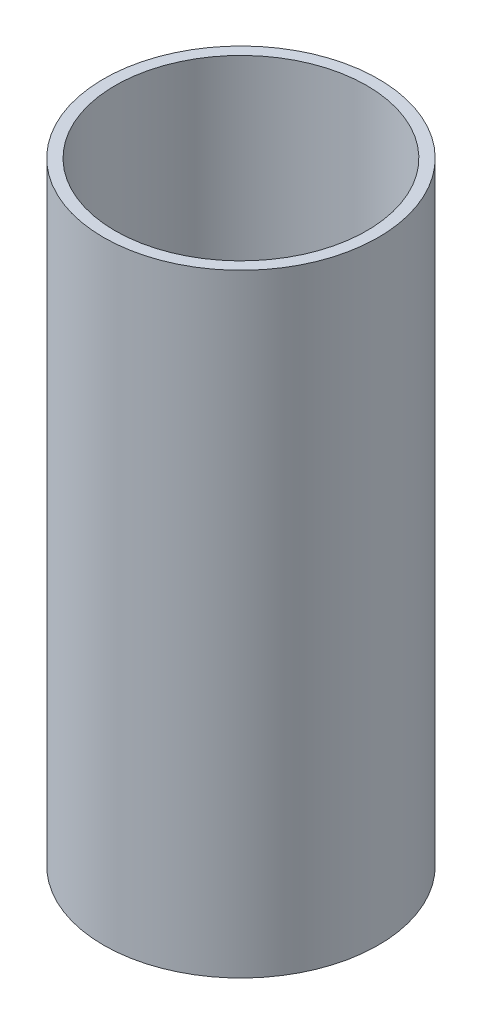
ISO-10303-21;
HEADER;
FILE_DESCRIPTION(('STEP AP214'),'2;1');
FILE_NAME('part.step','',(''),(''),'','','');
FILE_SCHEMA(('AUTOMOTIVE_DESIGN { 1 0 10303 214 1 1 1 1 }'));
ENDSEC;
DATA;
#1=APPLICATION_CONTEXT('core data for automotive mechanical design processes');
#2=APPLICATION_PROTOCOL_DEFINITION('international standard','automotive_design',2000,#1);
#3=PRODUCT_CONTEXT('',#1,'mechanical');
#4=PRODUCT('Part','Part','',(#3));
#5=PRODUCT_RELATED_PRODUCT_CATEGORY('part','',(#4));
#6=PRODUCT_DEFINITION_FORMATION('','',#4);
#7=PRODUCT_DEFINITION_CONTEXT('part definition',#1,'design');
#8=PRODUCT_DEFINITION('design','',#6,#7);
#9=PRODUCT_DEFINITION_SHAPE('','',#8);
#10=(LENGTH_UNIT() NAMED_UNIT(*) SI_UNIT(.MILLI.,.METRE.));
#11=(NAMED_UNIT(*) PLANE_ANGLE_UNIT() SI_UNIT($,.RADIAN.));
#12=(NAMED_UNIT(*) SI_UNIT($,.STERADIAN.) SOLID_ANGLE_UNIT());
#13=UNCERTAINTY_MEASURE_WITH_UNIT(LENGTH_MEASURE(1.E-05),#10,'distance_accuracy_value','');
#14=(GEOMETRIC_REPRESENTATION_CONTEXT(3) GLOBAL_UNCERTAINTY_ASSIGNED_CONTEXT((#13)) GLOBAL_UNIT_ASSIGNED_CONTEXT((#10,
#11,#12)) REPRESENTATION_CONTEXT('',''));
#15=CARTESIAN_POINT('',(0.,0.,0.));
#16=DIRECTION('',(0.,0.,1.));
#17=DIRECTION('',(1.,0.,0.));
#18=AXIS2_PLACEMENT_3D('',#15,#16,#17);
#19=CARTESIAN_POINT('',(0.,85.,0.));
#20=DIRECTION('',(0.,1.,0.));
#21=DIRECTION('',(0.,0.,1.));
#22=AXIS2_PLACEMENT_3D('',#19,#20,#21);
#23=PLANE('',#22);
#24=CARTESIAN_POINT('',(0.,85.,0.));
#25=DIRECTION('',(0.,1.,0.));
#26=DIRECTION('',(0.,0.,1.));
#27=AXIS2_PLACEMENT_3D('',#24,#25,#26);
#28=CIRCLE('',#27,19.05);
#29=CARTESIAN_POINT('',(0.,85.,19.05));
#30=VERTEX_POINT('',#29);
#31=EDGE_CURVE('E10',#30,#30,#28,.T.);
#32=ORIENTED_EDGE('',*,*,#31,.T.);
#33=EDGE_LOOP('',(#32));
#34=FACE_BOUND('',#33,.T.);
#35=CARTESIAN_POINT('',(0.,85.,0.));
#36=DIRECTION('',(0.,1.,0.));
#37=DIRECTION('',(0.,0.,1.));
#38=AXIS2_PLACEMENT_3D('',#35,#36,#37);
#39=CIRCLE('',#38,17.45);
#40=CARTESIAN_POINT('',(0.,85.,17.45));
#41=VERTEX_POINT('',#40);
#42=EDGE_CURVE('E42',#41,#41,#39,.T.);
#43=ORIENTED_EDGE('',*,*,#42,.F.);
#44=EDGE_LOOP('',(#43));
#45=FACE_BOUND('',#44,.T.);
#46=ADVANCED_FACE('F31',(#34,#45),#23,.T.);
#47=CARTESIAN_POINT('',(0.,0.,0.));
#48=DIRECTION('',(0.,1.,0.));
#49=DIRECTION('',(0.,0.,1.));
#50=AXIS2_PLACEMENT_3D('',#47,#48,#49);
#51=PLANE('',#50);
#52=CARTESIAN_POINT('',(0.,0.,0.));
#53=DIRECTION('',(0.,1.,0.));
#54=DIRECTION('',(0.,0.,1.));
#55=AXIS2_PLACEMENT_3D('',#52,#53,#54);
#56=CIRCLE('',#55,19.05);
#57=CARTESIAN_POINT('',(0.,0.,19.05));
#58=VERTEX_POINT('',#57);
#59=EDGE_CURVE('E35',#58,#58,#56,.T.);
#60=ORIENTED_EDGE('',*,*,#59,.F.);
#61=EDGE_LOOP('',(#60));
#62=FACE_BOUND('',#61,.T.);
#63=CARTESIAN_POINT('',(0.,0.,0.));
#64=DIRECTION('',(0.,1.,0.));
#65=DIRECTION('',(0.,0.,1.));
#66=AXIS2_PLACEMENT_3D('',#63,#64,#65);
#67=CIRCLE('',#66,17.45);
#68=CARTESIAN_POINT('',(0.,0.,17.45));
#69=VERTEX_POINT('',#68);
#70=EDGE_CURVE('E44',#69,#69,#67,.T.);
#71=ORIENTED_EDGE('',*,*,#70,.T.);
#72=EDGE_LOOP('',(#71));
#73=FACE_BOUND('',#72,.T.);
#74=ADVANCED_FACE('F54',(#62,#73),#51,.F.);
#75=CARTESIAN_POINT('',(0.,85.,0.));
#76=DIRECTION('',(0.,-1.,0.));
#77=DIRECTION('',(0.,0.,-1.));
#78=AXIS2_PLACEMENT_3D('',#75,#76,#77);
#79=CYLINDRICAL_SURFACE('',#78,19.05);
#80=ORIENTED_EDGE('',*,*,#31,.F.);
#81=EDGE_LOOP('',(#80));
#82=FACE_BOUND('',#81,.T.);
#83=ORIENTED_EDGE('',*,*,#59,.T.);
#84=EDGE_LOOP('',(#83));
#85=FACE_BOUND('',#84,.T.);
#86=ADVANCED_FACE('F33',(#82,#85),#79,.T.);
#87=CARTESIAN_POINT('',(0.,85.,0.));
#88=DIRECTION('',(0.,-1.,0.));
#89=DIRECTION('',(0.,0.,-1.));
#90=AXIS2_PLACEMENT_3D('',#87,#88,#89);
#91=CYLINDRICAL_SURFACE('',#90,17.45);
#92=ORIENTED_EDGE('',*,*,#42,.T.);
#93=EDGE_LOOP('',(#92));
#94=FACE_BOUND('',#93,.T.);
#95=ORIENTED_EDGE('',*,*,#70,.F.);
#96=EDGE_LOOP('',(#95));
#97=FACE_BOUND('',#96,.T.);
#98=ADVANCED_FACE('F50',(#94,#97),#91,.F.);
#99=CLOSED_SHELL('',(#46,#74,#86,#98));
#100=MANIFOLD_SOLID_BREP('B2',#99);
#101=ADVANCED_BREP_SHAPE_REPRESENTATION('',(#18,#100),#14);
#102=SHAPE_DEFINITION_REPRESENTATION(#9,#101);
ENDSEC;
END-ISO-10303-21;
